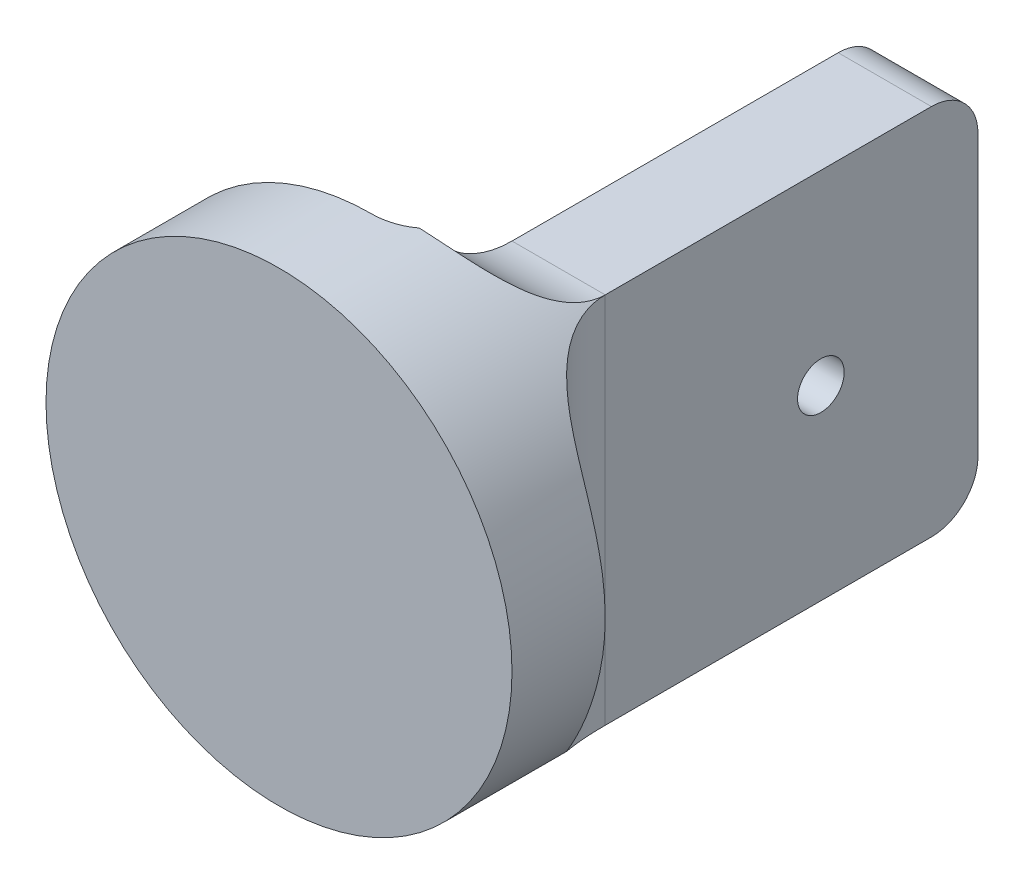
ISO-10303-21;
HEADER;
FILE_DESCRIPTION(('STEP AP214'),'2;1');
FILE_NAME('part.step','',(''),(''),'','','');
FILE_SCHEMA(('AUTOMOTIVE_DESIGN { 1 0 10303 214 1 1 1 1 }'));
ENDSEC;
DATA;
#1=APPLICATION_CONTEXT('core data for automotive mechanical design processes');
#2=APPLICATION_PROTOCOL_DEFINITION('international standard','automotive_design',2000,#1);
#3=PRODUCT_CONTEXT('',#1,'mechanical');
#4=PRODUCT('Part','Part','',(#3));
#5=PRODUCT_RELATED_PRODUCT_CATEGORY('part','',(#4));
#6=PRODUCT_DEFINITION_FORMATION('','',#4);
#7=PRODUCT_DEFINITION_CONTEXT('part definition',#1,'design');
#8=PRODUCT_DEFINITION('design','',#6,#7);
#9=PRODUCT_DEFINITION_SHAPE('','',#8);
#10=(LENGTH_UNIT() NAMED_UNIT(*) SI_UNIT(.MILLI.,.METRE.));
#11=(NAMED_UNIT(*) PLANE_ANGLE_UNIT() SI_UNIT($,.RADIAN.));
#12=(NAMED_UNIT(*) SI_UNIT($,.STERADIAN.) SOLID_ANGLE_UNIT());
#13=UNCERTAINTY_MEASURE_WITH_UNIT(LENGTH_MEASURE(1.E-05),#10,'distance_accuracy_value','');
#14=(GEOMETRIC_REPRESENTATION_CONTEXT(3) GLOBAL_UNCERTAINTY_ASSIGNED_CONTEXT((#13)) GLOBAL_UNIT_ASSIGNED_CONTEXT((#10,
#11,#12)) REPRESENTATION_CONTEXT('',''));
#15=CARTESIAN_POINT('',(0.,0.,0.));
#16=DIRECTION('',(0.,0.,1.));
#17=DIRECTION('',(1.,0.,0.));
#18=AXIS2_PLACEMENT_3D('',#15,#16,#17);
#19=CARTESIAN_POINT('',(0.,0.,0.));
#20=DIRECTION('',(0.,0.,1.));
#21=DIRECTION('',(1.,0.,0.));
#22=AXIS2_PLACEMENT_3D('',#19,#20,#21);
#23=PLANE('',#22);
#24=CARTESIAN_POINT('',(0.,0.,0.));
#25=DIRECTION('',(0.,0.,1.));
#26=DIRECTION('',(1.,0.,0.));
#27=AXIS2_PLACEMENT_3D('',#24,#25,#26);
#28=CIRCLE('',#27,25.);
#29=CARTESIAN_POINT('',(0.,25.,0.));
#30=VERTEX_POINT('',#29);
#31=CARTESIAN_POINT('',(0.,-25.,0.));
#32=VERTEX_POINT('',#31);
#33=EDGE_CURVE('E192',#30,#32,#28,.T.);
#34=ORIENTED_EDGE('',*,*,#33,.F.);
#35=DIRECTION('',(0.,1.,0.));
#36=VECTOR('',#35,1.);
#37=CARTESIAN_POINT('',(0.,-24.4948974278318,0.));
#38=LINE('',#37,#36);
#39=EDGE_CURVE('E173',#30,#32,#38,.F.);
#40=ORIENTED_EDGE('',*,*,#39,.T.);
#41=EDGE_LOOP('',(#34,#40));
#42=FACE_BOUND('',#41,.T.);
#43=ADVANCED_FACE('F40',(#42),#23,.F.);
#44=CARTESIAN_POINT('',(0.,0.,10.));
#45=DIRECTION('',(0.,0.,-1.));
#46=DIRECTION('',(-1.,0.,0.));
#47=AXIS2_PLACEMENT_3D('',#44,#45,#46);
#48=CYLINDRICAL_SURFACE('',#47,25.);
#49=CARTESIAN_POINT('',(0.,0.,10.));
#50=DIRECTION('',(0.,0.,1.));
#51=DIRECTION('',(1.,0.,0.));
#52=AXIS2_PLACEMENT_3D('',#49,#50,#51);
#53=CIRCLE('',#52,25.);
#54=CARTESIAN_POINT('',(25.,0.,10.));
#55=VERTEX_POINT('',#54);
#56=EDGE_CURVE('E267',#55,#55,#53,.T.);
#57=ORIENTED_EDGE('',*,*,#56,.F.);
#58=EDGE_LOOP('',(#57));
#59=FACE_BOUND('',#58,.T.);
#60=CARTESIAN_POINT('',(25.,0.,0.));
#61=CARTESIAN_POINT('',(25.0000046159509,0.349432953702817,-3.45399671139709E-05));
#62=CARTESIAN_POINT('',(24.9926739664145,0.698865563009704,-1.20042422913209E-06));
#63=CARTESIAN_POINT('',(24.9633752354935,1.39711824798957,-4.70913011507256E-05));
#64=CARTESIAN_POINT('',(24.9414070861986,1.74593832081317,-0.000126322243227558));
#65=CARTESIAN_POINT('',(24.8828492284115,2.44255577104218,-0.000645840196986684));
#66=CARTESIAN_POINT('',(24.8462509220083,2.79035242571184,-0.00108633968082242));
#67=CARTESIAN_POINT('',(24.7584991770932,3.48410114457858,-0.0028196038225481));
#68=CARTESIAN_POINT('',(24.7073458028763,3.83005321691695,-0.00411236471572473));
#69=CARTESIAN_POINT('',(24.5901175388926,4.52219890700806,-0.00823038372369184));
#70=CARTESIAN_POINT('',(24.5239289856145,4.86837321924046,-0.0110675582001229));
#71=CARTESIAN_POINT('',(24.3769846292835,5.55758705443547,-0.019155048986845));
#72=CARTESIAN_POINT('',(24.2962288920155,5.90062659154725,-0.0244053543996924));
#73=CARTESIAN_POINT('',(24.1203399015249,6.58279706894839,-0.0383745381544412));
#74=CARTESIAN_POINT('',(24.0252121235208,6.92192944499528,-0.0470920976560804));
#75=CARTESIAN_POINT('',(23.8207737659331,7.59570239575116,-0.0692406547315912));
#76=CARTESIAN_POINT('',(23.7114641281758,7.93034326711689,-0.0826713394046322));
#77=CARTESIAN_POINT('',(23.425920817176,8.74576410815089,-0.123179169715731));
#78=CARTESIAN_POINT('',(23.241883080716,9.22367787968666,-0.153685687050924));
#79=CARTESIAN_POINT('',(22.8453932256898,10.1660864988862,-0.232783440025726));
#80=CARTESIAN_POINT('',(22.6329407350234,10.6305811707257,-0.281374912508408));
#81=CARTESIAN_POINT('',(22.1821669403672,11.541611496397,-0.402391184638451));
#82=CARTESIAN_POINT('',(21.9439420813763,11.9882060833815,-0.474729056908303));
#83=CARTESIAN_POINT('',(21.4436869797028,12.8616157421083,-0.649981524172594));
#84=CARTESIAN_POINT('',(21.1816668516267,13.2884391025386,-0.752883169329952));
#85=CARTESIAN_POINT('',(20.725323208428,13.9847959905312,-0.957436402753174));
#86=CARTESIAN_POINT('',(20.5362865413855,14.2608175927629,-1.04887415145191));
#87=CARTESIAN_POINT('',(20.1510049070291,14.8002270315322,-1.25159310198008));
#88=CARTESIAN_POINT('',(19.9547619039733,15.0636182662994,-1.36286892788349));
#89=CARTESIAN_POINT('',(19.557524485144,15.5758860433591,-1.60751383455325));
#90=CARTESIAN_POINT('',(19.3565336742949,15.8247731302174,-1.74086658742647));
#91=CARTESIAN_POINT('',(18.9526464275802,16.306313374233,-2.03184990158062));
#92=CARTESIAN_POINT('',(18.7497504051798,16.5389699653567,-2.18947530460245));
#93=CARTESIAN_POINT('',(18.3863208897786,16.9411111499699,-2.49640828143243));
#94=CARTESIAN_POINT('',(18.2254680022492,17.1138950942298,-2.64102194218626));
#95=CARTESIAN_POINT('',(17.907058138408,17.4467842207978,-2.94741434049054));
#96=CARTESIAN_POINT('',(17.749500398098,17.6068923665878,-3.10918904513304));
#97=CARTESIAN_POINT('',(17.4400724815678,17.9134392836471,-3.45015440398656));
#98=CARTESIAN_POINT('',(17.2882012239211,18.0598806619805,-3.62934172321097));
#99=CARTESIAN_POINT('',(16.9926763495596,18.3382158926056,-4.00501271570519));
#100=CARTESIAN_POINT('',(16.8490228191754,18.4701095920814,-4.20149657062739));
#101=CARTESIAN_POINT('',(16.5714798633125,18.7195395447261,-4.61278609001379));
#102=CARTESIAN_POINT('',(16.4376775180196,18.8369528063389,-4.82772546888049));
#103=CARTESIAN_POINT('',(16.183796365624,19.0555192912901,-5.27344480114787));
#104=CARTESIAN_POINT('',(16.0637180949536,19.1566718791109,-5.50422537316886));
#105=CARTESIAN_POINT('',(15.8398893839157,19.3421570617477,-5.97987316292921));
#106=CARTESIAN_POINT('',(15.7361300357316,19.4264988396494,-6.2247325952241));
#107=CARTESIAN_POINT('',(15.5471388594581,19.5780789331575,-6.72658123203546));
#108=CARTESIAN_POINT('',(15.461903791247,19.6453202401947,-6.98356830569345));
#109=CARTESIAN_POINT('',(15.3238714828583,19.7531096533278,-7.46526430288376));
#110=CARTESIAN_POINT('',(15.2680651158112,19.7962083898952,-7.68854824422633));
#111=CARTESIAN_POINT('',(15.1717233436877,19.8701410585593,-8.14034584792389));
#112=CARTESIAN_POINT('',(15.1311852716773,19.9009771326447,-8.36885858955348));
#113=CARTESIAN_POINT('',(15.0659167091916,19.9504347877997,-8.83020755769252));
#114=CARTESIAN_POINT('',(15.0412360636203,19.969017858563,-9.06305507259347));
#115=CARTESIAN_POINT('',(15.0165153332662,19.987605104781,-9.41366343478824));
#116=CARTESIAN_POINT('',(15.0103251198146,19.9922529598163,-9.53079041086811));
#117=CARTESIAN_POINT('',(15.0020668833307,19.9984500378845,-9.76527311182051));
#118=CARTESIAN_POINT('',(14.999998919837,19.9999992161624,-9.88262883997245));
#119=CARTESIAN_POINT('',(15.,20.,-10.));
#120=B_SPLINE_CURVE_WITH_KNOTS('',3,(#60,#61,#62,#63,#64,#65,#66,#67,#68,#69,#70,#71,#72,#73,
#74,#75,#76,#77,#78,#79,#80,#81,#82,#83,#84,#85,#86,#87,#88,#89,#90,#91,#92,#93,#94,#95,#96,#97,
#98,#99,#100,#101,#102,#103,#104,#105,#106,#107,#108,#109,#110,#111,#112,#113,#114,#115,#116,
#117,#118,#119),.UNSPECIFIED.,.F.,.F.,(4,2,2,2,2,2,2,2,2,2,2,2,2,2,2,2,2,2,2,2,2,2,2,2,2,2,2,2,
2,4),(0.,1.04822147170246,2.09644780664092,3.14529107532984,4.19412971097106,5.25117809412387,
6.30822170380515,7.36486362948594,8.42143541877221,9.95928355140511,11.4971518246185,
13.0294521262998,14.5611041179134,15.6008118618453,16.6402382821788,17.6788993586998,
18.7173400098519,19.5470998832674,20.3766651902655,21.2060719250535,22.0354873715095,
22.8715225654577,23.7075904263201,24.5432003168327,25.3786639311844,26.0802760063424,
26.7817654730572,27.4854492926859,27.8374985171506,28.1895528263039),.UNSPECIFIED.);
#121=CARTESIAN_POINT('',(25.,0.,0.));
#122=VERTEX_POINT('',#121);
#123=CARTESIAN_POINT('',(15.,20.,-10.));
#124=VERTEX_POINT('',#123);
#125=EDGE_CURVE('E118',#122,#124,#120,.T.);
#126=ORIENTED_EDGE('',*,*,#125,.T.);
#127=CARTESIAN_POINT('',(15.,20.,-10.));
#128=CARTESIAN_POINT('',(15.000000368758,19.999998483752,-9.90460371137096));
#129=CARTESIAN_POINT('',(14.9981794926783,20.0013655327324,-9.80922230876917));
#130=CARTESIAN_POINT('',(14.9909053300932,20.0068185237063,-9.61868042758798));
#131=CARTESIAN_POINT('',(14.985452215542,20.0109043369903,-9.52351993876427));
#132=CARTESIAN_POINT('',(14.96367127868,20.0272038551653,-9.2387986257714));
#133=CARTESIAN_POINT('',(14.9419218261458,20.0434596990857,-9.0498409944975));
#134=CARTESIAN_POINT('',(14.8844397750932,20.0861821368348,-8.67664458894177));
#135=CARTESIAN_POINT('',(14.8488056429991,20.1125768105229,-8.49238211165316));
#136=CARTESIAN_POINT('',(14.7639811423131,20.1749257043843,-8.12864720166906));
#137=CARTESIAN_POINT('',(14.7147897593399,20.2108806398688,-7.94917512850399));
#138=CARTESIAN_POINT('',(14.6035428527405,20.2914078498538,-7.59669802467493));
#139=CARTESIAN_POINT('',(14.541514019282,20.3359622326089,-7.42368044171297));
#140=CARTESIAN_POINT('',(14.4051870119877,20.4327573868988,-7.0847027708863));
#141=CARTESIAN_POINT('',(14.3308834262005,20.4850015477524,-6.91874583683865));
#142=CARTESIAN_POINT('',(14.1707318232288,20.5961124604615,-6.59467163898267));
#143=CARTESIAN_POINT('',(14.0848759475672,20.6549837159228,-6.43655981293168));
#144=CARTESIAN_POINT('',(13.9024677894584,20.7781985245378,-6.12884011003592));
#145=CARTESIAN_POINT('',(13.8059116727839,20.8425440373563,-5.97923531076709));
#146=CARTESIAN_POINT('',(13.5147653622096,21.0333621637981,-5.56284739075482));
#147=CARTESIAN_POINT('',(13.3078277852501,21.165282715701,-5.307066261446));
#148=CARTESIAN_POINT('',(12.8650672516241,21.4372942648249,-4.82735356059047));
#149=CARTESIAN_POINT('',(12.6292470624655,21.5773844785629,-4.60341894197461));
#150=CARTESIAN_POINT('',(12.1321400084591,21.8607751607148,-4.18473705622961));
#151=CARTESIAN_POINT('',(11.8707142828961,22.0040894721007,-3.99016533312621));
#152=CARTESIAN_POINT('',(11.3276979347034,22.2885021289161,-3.62931280696413));
#153=CARTESIAN_POINT('',(11.0460903802653,22.4295984896585,-3.46305616350226));
#154=CARTESIAN_POINT('',(10.4655691637553,22.706290834931,-3.15568028151899));
#155=CARTESIAN_POINT('',(10.1665994984812,22.8418663115536,-3.01464914566645));
#156=CARTESIAN_POINT('',(9.55535772013658,23.1042369341131,-2.75552351783486));
#157=CARTESIAN_POINT('',(9.24308882088028,23.2310341821169,-2.63742352237094));
#158=CARTESIAN_POINT('',(8.61415076106215,23.4714180108463,-2.42352584740173));
#159=CARTESIAN_POINT('',(8.29770083186422,23.5852210922946,-2.32732284705193));
#160=CARTESIAN_POINT('',(7.65626543304726,23.8011794929119,-2.15181668058429));
#161=CARTESIAN_POINT('',(7.33127933405196,23.9033339502391,-2.07251476454318));
#162=CARTESIAN_POINT('',(6.67499402964776,24.0948358768326,-1.92885802663078));
#163=CARTESIAN_POINT('',(6.34370710874135,24.1842058479972,-1.86447681586633));
#164=CARTESIAN_POINT('',(5.67566460067085,24.3496452635155,-1.74871661087124));
#165=CARTESIAN_POINT('',(5.33891006278793,24.4257172276527,-1.69733515254492));
#166=CARTESIAN_POINT('',(4.76229669147013,24.5434187444668,-1.61971983906676));
#167=CARTESIAN_POINT('',(4.52353301992748,24.588549809578,-1.59055831530323));
#168=CARTESIAN_POINT('',(4.04443407026775,24.6718799481672,-1.53752326615536));
#169=CARTESIAN_POINT('',(3.8041003673843,24.7100851120243,-1.51364509067584));
#170=CARTESIAN_POINT('',(3.56304477219613,24.7447916126066,-1.49219271462558));
#171=B_SPLINE_CURVE_WITH_KNOTS('',3,(#127,#128,#129,#130,#131,#132,#133,#134,#135,#136,#137,
#138,#139,#140,#141,#142,#143,#144,#145,#146,#147,#148,#149,#150,#151,#152,#153,#154,#155,#156,
#157,#158,#159,#160,#161,#162,#163,#164,#165,#166,#167,#168,#169,#170),.UNSPECIFIED.,.F.,.F.,(4,
2,2,2,2,2,2,2,2,2,2,2,2,2,2,2,2,2,2,2,2,4),(0.,0.28613220946486,0.572250874071506,
1.14401924796472,1.71180450590527,2.27963225824217,2.84629109849558,3.41320044933045,
3.98049741006994,4.54799831220931,5.60807776681834,6.66805572485268,7.73413899803005,
8.80112738924817,9.87177252060851,10.9421603781419,11.9907428001641,13.0394027529476,
14.086193636394,15.1327859523178,15.8668404508198,16.6002462844248),.UNSPECIFIED.);
#172=CARTESIAN_POINT('',(3.56304477219613,24.7447916126066,-1.49219271462558));
#173=VERTEX_POINT('',#172);
#174=EDGE_CURVE('E64',#124,#173,#171,.T.);
#175=ORIENTED_EDGE('',*,*,#174,.T.);
#176=CARTESIAN_POINT('',(3.56304477219613,24.7447916126066,-1.49219271462558));
#177=CARTESIAN_POINT('',(3.46479568104161,24.7589419425906,-1.3923784238763));
#178=CARTESIAN_POINT('',(3.36233587103662,24.7730950559716,-1.29671058569221));
#179=CARTESIAN_POINT('',(3.14971931088456,24.8010225591477,-1.11427516317151));
#180=CARTESIAN_POINT('',(3.03956213547426,24.8147969279591,-1.02750807123702));
#181=CARTESIAN_POINT('',(2.8121323177158,24.841599156264,-0.8633814913431));
#182=CARTESIAN_POINT('',(2.6948502318873,24.8546259784559,-0.786034916039318));
#183=CARTESIAN_POINT('',(2.45411280229474,24.8795491898831,-0.641440387404467));
#184=CARTESIAN_POINT('',(2.33065786029156,24.8914456525421,-0.574191777983868));
#185=CARTESIAN_POINT('',(2.07826991017084,24.9137885697029,-0.450210417843046));
#186=CARTESIAN_POINT('',(1.94933073567569,24.9242333324644,-0.39348991067214));
#187=CARTESIAN_POINT('',(1.68701331129949,24.9433613756515,-0.291092655198119));
#188=CARTESIAN_POINT('',(1.55363515079903,24.9520446915194,-0.245415684682275));
#189=CARTESIAN_POINT('',(1.28366917217953,24.9673874392098,-0.165543474078923));
#190=CARTESIAN_POINT('',(1.14708845545735,24.9740509628928,-0.131325005476799));
#191=CARTESIAN_POINT('',(0.871496973491643,24.9851855492483,-0.0745281263692388));
#192=CARTESIAN_POINT('',(0.732487425265588,24.9896576790846,-0.0519440498773154));
#193=CARTESIAN_POINT('',(0.4943934545442,24.9953047740965,-0.0235159341925867));
#194=CARTESIAN_POINT('',(0.39566776846988,24.9970638255859,-0.0146958002071293));
#195=CARTESIAN_POINT('',(0.197964712283686,24.9994120544301,-0.00293972657877377));
#196=CARTESIAN_POINT('',(0.0989877517209831,25.0000025492448,2.83961561373932E-06));
#197=CARTESIAN_POINT('',(0.,25.,0.));
#198=B_SPLINE_CURVE_WITH_KNOTS('',3,(#176,#177,#178,#179,#180,#181,#182,#183,#184,#185,#186,
#187,#188,#189,#190,#191,#192,#193,#194,#195,#196,#197),.UNSPECIFIED.,.F.,.F.,(4,2,2,2,2,2,2,2,
2,2,4),(0.,0.4221842969074,0.844391937077718,1.26717193331088,1.68992444859738,2.1131655608067,
2.53639815605318,2.95876751141122,3.38093097661401,3.67816282825741,3.97505938195277),.UNSPECIFIED.);
#199=EDGE_CURVE('E172',#173,#30,#198,.T.);
#200=ORIENTED_EDGE('',*,*,#199,.T.);
#201=ORIENTED_EDGE('',*,*,#33,.T.);
#202=CARTESIAN_POINT('',(0.,-25.,0.));
#203=CARTESIAN_POINT('',(0.139067941625275,-25.000011515138,1.65544081296386E-05));
#204=CARTESIAN_POINT('',(0.278131674336748,-24.9988400077698,-0.00580124617566364));
#205=CARTESIAN_POINT('',(0.555243656303546,-24.9942143656643,-0.0289849795968277));
#206=CARTESIAN_POINT('',(0.693291991291745,-24.9907604259289,-0.0463499258924752));
#207=CARTESIAN_POINT('',(0.967350216120895,-24.9816546391409,-0.0925006759157653));
#208=CARTESIAN_POINT('',(1.10336068909617,-24.9760034338107,-0.121283145147235));
#209=CARTESIAN_POINT('',(1.37241572744407,-24.9626642610375,-0.1900362875354));
#210=CARTESIAN_POINT('',(1.50546038439968,-24.9549763565814,-0.230006614698269));
#211=CARTESIAN_POINT('',(1.76770159405711,-24.9377727224976,-0.320844711176445));
#212=CARTESIAN_POINT('',(1.89689687127807,-24.9282563946385,-0.371716047760295));
#213=CARTESIAN_POINT('',(2.15050908037118,-24.9076594197956,-0.483968501504646));
#214=CARTESIAN_POINT('',(2.27492596112185,-24.8965787560816,-0.545349731066501));
#215=CARTESIAN_POINT('',(2.51797850060264,-24.8731717640665,-0.678086770045653));
#216=CARTESIAN_POINT('',(2.63662156512102,-24.8608470973294,-0.749429322129395));
#217=CARTESIAN_POINT('',(2.86747460222681,-24.8352787615647,-0.901623116296223));
#218=CARTESIAN_POINT('',(2.9796872727714,-24.8220354831851,-0.982470326478427));
#219=CARTESIAN_POINT('',(3.17193323062921,-24.7981035719909,-1.13345854812025));
#220=CARTESIAN_POINT('',(3.2534230037314,-24.7875295258644,-1.20177329907035));
#221=CARTESIAN_POINT('',(3.41175393127952,-24.7662333641178,-1.34333458699481));
#222=CARTESIAN_POINT('',(3.4886019746197,-24.7555114984552,-1.41657345666005));
#223=CARTESIAN_POINT('',(3.56304477219613,-24.7447916126066,-1.49219271462558));
#224=B_SPLINE_CURVE_WITH_KNOTS('',3,(#202,#203,#204,#205,#206,#207,#208,#209,#210,#211,#212,
#213,#214,#215,#216,#217,#218,#219,#220,#221,#222,#223),.UNSPECIFIED.,.F.,.F.,(4,2,2,2,2,2,2,2,
2,2,4),(0.,0.417070906885443,0.834106185486118,1.25101975818357,1.66792043890582,
2.08495775596897,2.50199953344741,2.91849147663077,3.33480737604872,3.65518429791174,
3.9750734265343),.UNSPECIFIED.);
#225=CARTESIAN_POINT('',(3.56304477219613,-24.7447916126066,-1.49219271462558));
#226=VERTEX_POINT('',#225);
#227=EDGE_CURVE('E50',#32,#226,#224,.T.);
#228=ORIENTED_EDGE('',*,*,#227,.T.);
#229=CARTESIAN_POINT('',(3.56304477219613,-24.7447916126066,-1.49219271462558));
#230=CARTESIAN_POINT('',(3.80386380981412,-24.7101182354389,-1.51362313294646));
#231=CARTESIAN_POINT('',(4.04395490999744,-24.6719556833986,-1.53747517553623));
#232=CARTESIAN_POINT('',(4.52305239828068,-24.5886410058038,-1.59050014253432));
#233=CARTESIAN_POINT('',(4.76205364339555,-24.5434689911747,-1.61968825115972));
#234=CARTESIAN_POINT('',(5.41033267168758,-24.4111369549297,-1.70694708165892));
#235=CARTESIAN_POINT('',(5.81752829916441,-24.3172668500559,-1.77062273933733));
#236=CARTESIAN_POINT('',(6.62359540649537,-24.1101885957646,-1.91753455196024));
#237=CARTESIAN_POINT('',(7.02246335803931,-23.9969724290884,-2.00077882178621));
#238=CARTESIAN_POINT('',(7.80880847730482,-23.7527226058729,-2.19004573292436));
#239=CARTESIAN_POINT('',(8.19629614073143,-23.6217060365401,-2.29604658535724));
#240=CARTESIAN_POINT('',(8.95701494090954,-23.3438549546819,-2.53479392248256));
#241=CARTESIAN_POINT('',(9.33025402482736,-23.197029439518,-2.66752523109405));
#242=CARTESIAN_POINT('',(9.90433013115736,-22.9555278953163,-2.90137667329253));
#243=CARTESIAN_POINT('',(10.1112393584226,-22.8650994418645,-2.99207915608406));
#244=CARTESIAN_POINT('',(10.5181281055857,-22.6808026575916,-3.18478610986706));
#245=CARTESIAN_POINT('',(10.7181089315336,-22.586934982027,-3.28678843537733));
#246=CARTESIAN_POINT('',(11.1100364482988,-22.3967517200867,-3.50297557313264));
#247=CARTESIAN_POINT('',(11.3019874894388,-22.300437505859,-3.61715366667412));
#248=CARTESIAN_POINT('',(11.6767543911186,-22.1065148955201,-3.85859519446928));
#249=CARTESIAN_POINT('',(11.8595707258747,-22.0089065669246,-3.98585794839921));
#250=CARTESIAN_POINT('',(12.354679098166,-21.7368941304088,-4.3600362022938));
#251=CARTESIAN_POINT('',(12.6556657877791,-21.5624937024233,-4.62231009925595));
#252=CARTESIAN_POINT('',(13.2157314112813,-21.2238453204421,-5.19486732063013));
#253=CARTESIAN_POINT('',(13.474807185525,-21.059598132471,-5.50515426127725));
#254=CARTESIAN_POINT('',(13.8254550531312,-20.8297106664569,-6.00746844488061));
#255=CARTESIAN_POINT('',(13.9365331006092,-20.7554530711782,-6.1821585137484));
#256=CARTESIAN_POINT('',(14.1440529156528,-20.6145927236057,-6.54289774917025));
#257=CARTESIAN_POINT('',(14.2405025205045,-20.5479858770469,-6.72894075784979));
#258=CARTESIAN_POINT('',(14.4173841958279,-20.4242672814121,-7.11112010162743));
#259=CARTESIAN_POINT('',(14.4978422610309,-20.3671401481565,-7.30723939325137));
#260=CARTESIAN_POINT('',(14.6417783252794,-20.2639133958091,-7.70839372462543));
#261=CARTESIAN_POINT('',(14.705262023413,-20.2178100760591,-7.91342574500936));
#262=CARTESIAN_POINT('',(14.7992692452483,-20.149044996298,-8.27304349322701));
#263=CARTESIAN_POINT('',(14.8340549552554,-20.1234242557284,-8.4259678842339));
#264=CARTESIAN_POINT('',(14.8939276322245,-20.0791509265913,-8.73467116784114));
#265=CARTESIAN_POINT('',(14.9190172149452,-20.0604964587535,-8.89044927868891));
#266=CARTESIAN_POINT('',(14.95936653521,-20.0304275117068,-9.20463817474296));
#267=CARTESIAN_POINT('',(14.9745845379076,-20.0190437746101,-9.36305727016772));
#268=CARTESIAN_POINT('',(14.994911691989,-20.0038158893651,-9.68098031925999));
#269=CARTESIAN_POINT('',(15.000015848924,-19.9999754662863,-9.84048476990897));
#270=CARTESIAN_POINT('',(15.,-20.,-10.));
#271=B_SPLINE_CURVE_WITH_KNOTS('',3,(#229,#230,#231,#232,#233,#234,#235,#236,#237,#238,#239,
#240,#241,#242,#243,#244,#245,#246,#247,#248,#249,#250,#251,#252,#253,#254,#255,#256,#257,#258,
#259,#260,#261,#262,#263,#264,#265,#266,#267,#268,#269,#270),.UNSPECIFIED.,.F.,.F.,(4,2,2,2,2,2,
2,2,2,2,2,2,2,2,2,2,2,2,2,2,4),(0.,0.732671024319646,1.4674603278368,2.73458650846945,
4.00223908180755,5.26868327893591,6.53441047560694,7.26411278354724,7.99367678089096,
8.72284026096678,9.45196584807444,10.7547840552762,12.0577004356366,12.7167251680341,
13.375395566743,14.0329863590726,14.6903560894216,15.166648756737,15.6428128430411,
16.1209771465103,16.5993775196822),.UNSPECIFIED.);
#272=CARTESIAN_POINT('',(15.,-20.,-10.));
#273=VERTEX_POINT('',#272);
#274=EDGE_CURVE('E56',#226,#273,#271,.T.);
#275=ORIENTED_EDGE('',*,*,#274,.T.);
#276=CARTESIAN_POINT('',(15.,-20.,-10.));
#277=CARTESIAN_POINT('',(14.9999544474207,-20.0000019256207,-9.76769462868317));
#278=CARTESIAN_POINT('',(15.0080929267355,-19.9939293575422,-9.53539914160228));
#279=CARTESIAN_POINT('',(15.0404069350246,-19.9696497604848,-9.07260864137797));
#280=CARTESIAN_POINT('',(15.0645793169829,-19.9514451126975,-8.84211328389877));
#281=CARTESIAN_POINT('',(15.1285279258781,-19.9029934815473,-8.38534286158488));
#282=CARTESIAN_POINT('',(15.1682539981283,-19.8727852006747,-8.15905665646658));
#283=CARTESIAN_POINT('',(15.2626775569431,-19.8003594280702,-7.71158985934686));
#284=CARTESIAN_POINT('',(15.3173752016383,-19.7581418094949,-7.49040932129854));
#285=CARTESIAN_POINT('',(15.4408831561763,-19.6617712142473,-7.05474159051967));
#286=CARTESIAN_POINT('',(15.5096908702974,-19.6076204326913,-6.84025317504017));
#287=CARTESIAN_POINT('',(15.6603669797968,-19.4874878756637,-6.41932557463815));
#288=CARTESIAN_POINT('',(15.7422360036319,-19.4215055308868,-6.21288677762538));
#289=CARTESIAN_POINT('',(15.9178019462584,-19.2778742704624,-5.80928193798633));
#290=CARTESIAN_POINT('',(16.0115004610714,-19.2002237802924,-5.61211715153519));
#291=CARTESIAN_POINT('',(16.2093285924134,-19.0335070749173,-5.22812955184818));
#292=CARTESIAN_POINT('',(16.3134584022088,-18.9444406481941,-5.04130693032709));
#293=CARTESIAN_POINT('',(16.5334979194005,-18.752740599462,-4.67408694702865));
#294=CARTESIAN_POINT('',(16.6496443462394,-18.6498132676828,-4.49398505626831));
#295=CARTESIAN_POINT('',(16.8896773468836,-18.432714968241,-4.14617032867569));
#296=CARTESIAN_POINT('',(17.0135638613238,-18.3185440868107,-3.97845739684369));
#297=CARTESIAN_POINT('',(17.2674446813404,-18.0794291163717,-3.6557305556387));
#298=CARTESIAN_POINT('',(17.3974408693146,-17.9544816970647,-3.50072060096508));
#299=CARTESIAN_POINT('',(17.6618901658091,-17.6944075897653,-3.20355035200659));
#300=CARTESIAN_POINT('',(17.7963441775275,-17.5592788317904,-3.0613926837333));
#301=CARTESIAN_POINT('',(18.1222447821601,-17.2237762172362,-2.73580158968605));
#302=CARTESIAN_POINT('',(18.3150859826731,-17.018831616906,-2.5584449421077));
#303=CARTESIAN_POINT('',(18.7026215812628,-16.5920197076693,-2.22774280832841));
#304=CARTESIAN_POINT('',(18.897316548963,-16.3701470399338,-2.07440497292895));
#305=CARTESIAN_POINT('',(19.2854937280005,-15.9110084447857,-1.79010534913545));
#306=CARTESIAN_POINT('',(19.4789741996376,-15.6737243293046,-1.6591706873741));
#307=CARTESIAN_POINT('',(19.861823086655,-15.1856610978914,-1.41802228976428));
#308=CARTESIAN_POINT('',(20.0511902745907,-14.9348780293255,-1.30781466592753));
#309=CARTESIAN_POINT('',(20.503756244849,-14.3108867326178,-1.06268421019479));
#310=CARTESIAN_POINT('',(20.7636624469471,-13.9314328943902,-0.937531823478148));
#311=CARTESIAN_POINT('',(21.2658350427095,-13.1521662209654,-0.719319868492703));
#312=CARTESIAN_POINT('',(21.5080936138608,-12.7523444893035,-0.626274464540282));
#313=CARTESIAN_POINT('',(21.9722508715262,-11.9348919848639,-0.466211361781585));
#314=CARTESIAN_POINT('',(22.1941022210551,-11.5172229414369,-0.399253067192524));
#315=CARTESIAN_POINT('',(22.6146861161517,-10.6677379048163,-0.286210400068965));
#316=CARTESIAN_POINT('',(22.8134192897809,-10.2359222963574,-0.240125460360479));
#317=CARTESIAN_POINT('',(23.1308755550073,-9.49075309596489,-0.175327010071725));
#318=CARTESIAN_POINT('',(23.2558151545867,-9.18036588503581,-0.152549301352628));
#319=CARTESIAN_POINT('',(23.4932663712132,-8.55444103500423,-0.113431111241263));
#320=CARTESIAN_POINT('',(23.60577701841,-8.23890299617659,-0.0970911319400031));
#321=CARTESIAN_POINT('',(23.8181200028185,-7.60325567441595,-0.0695104333791623));
#322=CARTESIAN_POINT('',(23.91794784397,-7.28314481490416,-0.0582715188372613));
#323=CARTESIAN_POINT('',(24.1046841785804,-6.63902504572305,-0.0397181334085059));
#324=CARTESIAN_POINT('',(24.1915910864042,-6.31501566289861,-0.0324041438949023));
#325=CARTESIAN_POINT('',(24.3521985479187,-5.6641532620826,-0.020680019726942));
#326=CARTESIAN_POINT('',(24.4259166818367,-5.33730464773368,-0.0162659981998946));
#327=CARTESIAN_POINT('',(24.5601532217831,-4.68092650348939,-0.00945189305866386));
#328=CARTESIAN_POINT('',(24.6206731211415,-4.35139728127563,-0.00705158151328772));
#329=CARTESIAN_POINT('',(24.7283960315422,-3.69032975869593,-0.00354399907821539));
#330=CARTESIAN_POINT('',(24.7756054710901,-3.35879250744546,-0.00243610318112393));
#331=CARTESIAN_POINT('',(24.8566647160628,-2.69412051635443,-0.000944813003380129));
#332=CARTESIAN_POINT('',(24.8905162309109,-2.36098598644495,-0.000561325995787661));
#333=CARTESIAN_POINT('',(24.9313918147699,-1.85859301228581,-0.000226526121881477));
#334=CARTESIAN_POINT('',(24.9434056508824,-1.68972656857743,-0.000155287797385632));
#335=CARTESIAN_POINT('',(24.963999191122,-1.35180954631155,-5.9059999097377E-05));
#336=CARTESIAN_POINT('',(24.9725794294714,-1.18275900050511,-3.40633285210083E-05));
#337=CARTESIAN_POINT('',(24.9931453095933,-0.675956738440726,4.69093719138867E-06));
#338=CARTESIAN_POINT('',(25.0000020082629,-0.3379899275337,-1.75827729999736E-05));
#339=CARTESIAN_POINT('',(25.,0.,0.));
#340=B_SPLINE_CURVE_WITH_KNOTS('',3,(#276,#277,#278,#279,#280,#281,#282,#283,#284,#285,#286,
#287,#288,#289,#290,#291,#292,#293,#294,#295,#296,#297,#298,#299,#300,#301,#302,#303,#304,#305,
#306,#307,#308,#309,#310,#311,#312,#313,#314,#315,#316,#317,#318,#319,#320,#321,#322,#323,#324,
#325,#326,#327,#328,#329,#330,#331,#332,#333,#334,#335,#336,#337,#338,#339),.UNSPECIFIED.,.F.,
.F.,(4,2,2,2,2,2,2,2,2,2,2,2,2,2,2,2,2,2,2,2,2,2,2,2,2,2,2,2,2,2,2,4),(0.,0.696679256652002,
1.3932218146918,2.08753654787055,2.78185861472311,3.47605306684763,4.17028093084503,
4.86460255958196,5.55893705479097,6.27141540287411,6.98388828703913,7.6965821427073,
8.40942129022861,9.40583337917937,10.4025622163624,11.4004895195612,12.3987106328461,
13.8264601146285,15.2548386595049,16.6864510842066,18.1180246065827,19.1238037538083,
20.1296613281801,21.1358744904007,22.1422110316572,23.147195997523,24.1520671941064,
25.1564522370031,26.1607087062922,26.6685590148724,27.1763302779119,28.1901751577332),.UNSPECIFIED.);
#341=EDGE_CURVE('E115',#273,#122,#340,.T.);
#342=ORIENTED_EDGE('',*,*,#341,.T.);
#343=EDGE_LOOP('',(#126,#175,#200,#201,#228,#275,#342));
#344=FACE_BOUND('',#343,.T.);
#345=ADVANCED_FACE('F117',(#59,#344),#48,.T.);
#346=CARTESIAN_POINT('',(0.,0.,10.));
#347=DIRECTION('',(0.,0.,1.));
#348=DIRECTION('',(1.,0.,0.));
#349=AXIS2_PLACEMENT_3D('',#346,#347,#348);
#350=PLANE('',#349);
#351=ORIENTED_EDGE('',*,*,#56,.T.);
#352=EDGE_LOOP('',(#351));
#353=FACE_BOUND('',#352,.T.);
#354=ADVANCED_FACE('F284',(#353),#350,.T.);
#355=CARTESIAN_POINT('',(0.,-20.,-50.));
#356=DIRECTION('',(0.,1.,0.));
#357=DIRECTION('',(0.,0.,1.));
#358=AXIS2_PLACEMENT_3D('',#355,#356,#357);
#359=PLANE('',#358);
#360=DIRECTION('',(0.,0.,1.));
#361=VECTOR('',#360,1.);
#362=CARTESIAN_POINT('',(5.,-20.,-50.));
#363=LINE('',#362,#361);
#364=CARTESIAN_POINT('',(5.,-20.,-45.));
#365=VERTEX_POINT('',#364);
#366=CARTESIAN_POINT('',(5.,-20.,-10.));
#367=VERTEX_POINT('',#366);
#368=EDGE_CURVE('E208',#365,#367,#363,.T.);
#369=ORIENTED_EDGE('',*,*,#368,.F.);
#370=DIRECTION('',(-1.,0.,0.));
#371=VECTOR('',#370,1.);
#372=CARTESIAN_POINT('',(15.,-20.,-45.));
#373=LINE('',#372,#371);
#374=CARTESIAN_POINT('',(15.,-20.,-45.));
#375=VERTEX_POINT('',#374);
#376=EDGE_CURVE('E228',#365,#375,#373,.F.);
#377=ORIENTED_EDGE('',*,*,#376,.T.);
#378=DIRECTION('',(0.,0.,1.));
#379=VECTOR('',#378,1.);
#380=CARTESIAN_POINT('',(15.,-20.,-50.));
#381=LINE('',#380,#379);
#382=EDGE_CURVE('E259',#375,#273,#381,.T.);
#383=ORIENTED_EDGE('',*,*,#382,.T.);
#384=DIRECTION('',(-1.,0.,0.));
#385=VECTOR('',#384,1.);
#386=CARTESIAN_POINT('',(5.,-20.,-10.));
#387=LINE('',#386,#385);
#388=EDGE_CURVE('E128',#273,#367,#387,.T.);
#389=ORIENTED_EDGE('',*,*,#388,.T.);
#390=EDGE_LOOP('',(#369,#377,#383,#389));
#391=FACE_BOUND('',#390,.T.);
#392=ADVANCED_FACE('F271',(#391),#359,.F.);
#393=CARTESIAN_POINT('',(5.,0.,-50.));
#394=DIRECTION('',(1.,0.,0.));
#395=DIRECTION('',(0.,0.,-1.));
#396=AXIS2_PLACEMENT_3D('',#393,#394,#395);
#397=PLANE('',#396);
#398=CARTESIAN_POINT('',(5.,0.,-33.1408871272104));
#399=DIRECTION('',(-1.,0.,0.));
#400=DIRECTION('',(0.,0.,1.));
#401=AXIS2_PLACEMENT_3D('',#398,#399,#400);
#402=CIRCLE('',#401,2.5);
#403=CARTESIAN_POINT('',(5.,0.,-30.6408871272104));
#404=VERTEX_POINT('',#403);
#405=EDGE_CURVE('E312',#404,#404,#402,.T.);
#406=ORIENTED_EDGE('',*,*,#405,.F.);
#407=EDGE_LOOP('',(#406));
#408=FACE_BOUND('',#407,.T.);
#409=DIRECTION('',(0.,1.,0.));
#410=VECTOR('',#409,1.);
#411=CARTESIAN_POINT('',(5.,0.,-50.));
#412=LINE('',#411,#410);
#413=CARTESIAN_POINT('',(5.,-15.,-50.));
#414=VERTEX_POINT('',#413);
#415=CARTESIAN_POINT('',(5.,15.,-50.));
#416=VERTEX_POINT('',#415);
#417=EDGE_CURVE('E254',#414,#416,#412,.T.);
#418=ORIENTED_EDGE('',*,*,#417,.F.);
#419=CARTESIAN_POINT('',(5.,-15.,-45.));
#420=DIRECTION('',(1.,0.,0.));
#421=DIRECTION('',(0.,0.,-1.));
#422=AXIS2_PLACEMENT_3D('',#419,#420,#421);
#423=CIRCLE('',#422,5.);
#424=EDGE_CURVE('E226',#414,#365,#423,.F.);
#425=ORIENTED_EDGE('',*,*,#424,.T.);
#426=ORIENTED_EDGE('',*,*,#368,.T.);
#427=CARTESIAN_POINT('',(5.,-30.,-10.));
#428=DIRECTION('',(1.,0.,0.));
#429=DIRECTION('',(0.,0.,-1.));
#430=AXIS2_PLACEMENT_3D('',#427,#428,#429);
#431=CIRCLE('',#430,10.);
#432=CARTESIAN_POINT('',(5.,-21.3397459621556,-5.));
#433=VERTEX_POINT('',#432);
#434=EDGE_CURVE('E200',#367,#433,#431,.T.);
#435=ORIENTED_EDGE('',*,*,#434,.T.);
#436=DIRECTION('',(0.,1.,0.));
#437=VECTOR('',#436,1.);
#438=CARTESIAN_POINT('',(5.,24.4948974278318,-5.));
#439=LINE('',#438,#437);
#440=CARTESIAN_POINT('',(5.,21.3397459621556,-5.));
#441=VERTEX_POINT('',#440);
#442=EDGE_CURVE('E197',#433,#441,#439,.T.);
#443=ORIENTED_EDGE('',*,*,#442,.T.);
#444=CARTESIAN_POINT('',(5.,30.,-10.));
#445=DIRECTION('',(1.,0.,0.));
#446=DIRECTION('',(0.,0.,-1.));
#447=AXIS2_PLACEMENT_3D('',#444,#445,#446);
#448=CIRCLE('',#447,10.);
#449=CARTESIAN_POINT('',(5.,20.,-10.));
#450=VERTEX_POINT('',#449);
#451=EDGE_CURVE('E209',#441,#450,#448,.T.);
#452=ORIENTED_EDGE('',*,*,#451,.T.);
#453=DIRECTION('',(0.,0.,1.));
#454=VECTOR('',#453,1.);
#455=CARTESIAN_POINT('',(5.,20.,-50.));
#456=LINE('',#455,#454);
#457=CARTESIAN_POINT('',(5.,20.,-45.));
#458=VERTEX_POINT('',#457);
#459=EDGE_CURVE('E241',#458,#450,#456,.T.);
#460=ORIENTED_EDGE('',*,*,#459,.F.);
#461=CARTESIAN_POINT('',(5.,15.,-45.));
#462=DIRECTION('',(1.,0.,0.));
#463=DIRECTION('',(0.,0.,-1.));
#464=AXIS2_PLACEMENT_3D('',#461,#462,#463);
#465=CIRCLE('',#464,5.);
#466=EDGE_CURVE('E224',#458,#416,#465,.F.);
#467=ORIENTED_EDGE('',*,*,#466,.T.);
#468=EDGE_LOOP('',(#418,#425,#426,#435,#443,#452,#460,#467));
#469=FACE_BOUND('',#468,.T.);
#470=ADVANCED_FACE('F204',(#408,#469),#397,.F.);
#471=CARTESIAN_POINT('',(0.,20.,-50.));
#472=DIRECTION('',(0.,-1.,0.));
#473=DIRECTION('',(0.,0.,-1.));
#474=AXIS2_PLACEMENT_3D('',#471,#472,#473);
#475=PLANE('',#474);
#476=DIRECTION('',(0.,0.,1.));
#477=VECTOR('',#476,1.);
#478=CARTESIAN_POINT('',(15.,20.,-50.));
#479=LINE('',#478,#477);
#480=CARTESIAN_POINT('',(15.,20.,-45.));
#481=VERTEX_POINT('',#480);
#482=EDGE_CURVE('E244',#481,#124,#479,.T.);
#483=ORIENTED_EDGE('',*,*,#482,.F.);
#484=DIRECTION('',(1.,0.,0.));
#485=VECTOR('',#484,1.);
#486=CARTESIAN_POINT('',(5.,20.,-45.));
#487=LINE('',#486,#485);
#488=EDGE_CURVE('E233',#481,#458,#487,.F.);
#489=ORIENTED_EDGE('',*,*,#488,.T.);
#490=ORIENTED_EDGE('',*,*,#459,.T.);
#491=DIRECTION('',(1.,0.,0.));
#492=VECTOR('',#491,1.);
#493=CARTESIAN_POINT('',(15.,20.,-10.));
#494=LINE('',#493,#492);
#495=EDGE_CURVE('E125',#450,#124,#494,.T.);
#496=ORIENTED_EDGE('',*,*,#495,.T.);
#497=EDGE_LOOP('',(#483,#489,#490,#496));
#498=FACE_BOUND('',#497,.T.);
#499=ADVANCED_FACE('F294',(#498),#475,.F.);
#500=CARTESIAN_POINT('',(15.,0.,-50.));
#501=DIRECTION('',(-1.,0.,0.));
#502=DIRECTION('',(0.,0.,1.));
#503=AXIS2_PLACEMENT_3D('',#500,#501,#502);
#504=PLANE('',#503);
#505=CARTESIAN_POINT('',(15.,0.,-33.1408871272104));
#506=DIRECTION('',(-1.,0.,0.));
#507=DIRECTION('',(0.,0.,1.));
#508=AXIS2_PLACEMENT_3D('',#505,#506,#507);
#509=CIRCLE('',#508,2.5);
#510=CARTESIAN_POINT('',(15.,0.,-30.6408871272104));
#511=VERTEX_POINT('',#510);
#512=EDGE_CURVE('E45',#511,#511,#509,.T.);
#513=ORIENTED_EDGE('',*,*,#512,.T.);
#514=EDGE_LOOP('',(#513));
#515=FACE_BOUND('',#514,.T.);
#516=ORIENTED_EDGE('',*,*,#382,.F.);
#517=CARTESIAN_POINT('',(15.,-15.,-45.));
#518=DIRECTION('',(-1.,0.,0.));
#519=DIRECTION('',(0.,0.,1.));
#520=AXIS2_PLACEMENT_3D('',#517,#518,#519);
#521=CIRCLE('',#520,5.);
#522=CARTESIAN_POINT('',(15.,-15.,-50.));
#523=VERTEX_POINT('',#522);
#524=EDGE_CURVE('E232',#375,#523,#521,.F.);
#525=ORIENTED_EDGE('',*,*,#524,.T.);
#526=DIRECTION('',(0.,-1.,0.));
#527=VECTOR('',#526,1.);
#528=CARTESIAN_POINT('',(15.,0.,-50.));
#529=LINE('',#528,#527);
#530=CARTESIAN_POINT('',(15.,15.,-50.));
#531=VERTEX_POINT('',#530);
#532=EDGE_CURVE('E252',#531,#523,#529,.T.);
#533=ORIENTED_EDGE('',*,*,#532,.F.);
#534=CARTESIAN_POINT('',(15.,15.,-45.));
#535=DIRECTION('',(-1.,0.,0.));
#536=DIRECTION('',(0.,0.,1.));
#537=AXIS2_PLACEMENT_3D('',#534,#535,#536);
#538=CIRCLE('',#537,5.);
#539=EDGE_CURVE('E230',#531,#481,#538,.F.);
#540=ORIENTED_EDGE('',*,*,#539,.T.);
#541=ORIENTED_EDGE('',*,*,#482,.T.);
#542=DIRECTION('',(0.,-1.,0.));
#543=VECTOR('',#542,1.);
#544=CARTESIAN_POINT('',(15.,-20.,-10.));
#545=LINE('',#544,#543);
#546=EDGE_CURVE('E122',#124,#273,#545,.T.);
#547=ORIENTED_EDGE('',*,*,#546,.T.);
#548=EDGE_LOOP('',(#516,#525,#533,#540,#541,#547));
#549=FACE_BOUND('',#548,.T.);
#550=ADVANCED_FACE('F257',(#515,#549),#504,.F.);
#551=CARTESIAN_POINT('',(0.,0.,-50.));
#552=DIRECTION('',(0.,0.,-1.));
#553=DIRECTION('',(-1.,0.,0.));
#554=AXIS2_PLACEMENT_3D('',#551,#552,#553);
#555=PLANE('',#554);
#556=ORIENTED_EDGE('',*,*,#532,.T.);
#557=DIRECTION('',(-1.,0.,0.));
#558=VECTOR('',#557,1.);
#559=CARTESIAN_POINT('',(5.,-15.,-50.));
#560=LINE('',#559,#558);
#561=EDGE_CURVE('E220',#523,#414,#560,.T.);
#562=ORIENTED_EDGE('',*,*,#561,.T.);
#563=ORIENTED_EDGE('',*,*,#417,.T.);
#564=DIRECTION('',(1.,0.,0.));
#565=VECTOR('',#564,1.);
#566=CARTESIAN_POINT('',(15.,15.,-50.));
#567=LINE('',#566,#565);
#568=EDGE_CURVE('E211',#416,#531,#567,.T.);
#569=ORIENTED_EDGE('',*,*,#568,.T.);
#570=EDGE_LOOP('',(#556,#562,#563,#569));
#571=FACE_BOUND('',#570,.T.);
#572=ADVANCED_FACE('F148',(#571),#555,.T.);
#573=CARTESIAN_POINT('',(25.,0.,-10.));
#574=DIRECTION('',(0.,1.,0.));
#575=DIRECTION('',(0.,0.,1.));
#576=AXIS2_PLACEMENT_3D('',#573,#574,#575);
#577=CYLINDRICAL_SURFACE('',#576,10.);
#578=ORIENTED_EDGE('',*,*,#546,.F.);
#579=ORIENTED_EDGE('',*,*,#125,.F.);
#580=ORIENTED_EDGE('',*,*,#341,.F.);
#581=EDGE_LOOP('',(#578,#579,#580));
#582=FACE_BOUND('',#581,.T.);
#583=ADVANCED_FACE('F124',(#582),#577,.F.);
#584=CARTESIAN_POINT('',(0.,30.,-10.));
#585=DIRECTION('',(-1.,0.,0.));
#586=DIRECTION('',(0.,0.,1.));
#587=AXIS2_PLACEMENT_3D('',#584,#585,#586);
#588=CYLINDRICAL_SURFACE('',#587,10.);
#589=ORIENTED_EDGE('',*,*,#451,.F.);
#590=CARTESIAN_POINT('',(5.,21.3397459621556,-5.));
#591=CARTESIAN_POINT('',(4.99999967619836,21.3941466215564,-4.90576894578021));
#592=CARTESIAN_POINT('',(4.99733610987006,21.4500741363237,-4.81245878499947));
#593=CARTESIAN_POINT('',(4.98699395925781,21.5647902844219,-4.62794040043346));
#594=CARTESIAN_POINT('',(4.97931713207392,21.6235779086329,-4.53673145178471));
#595=CARTESIAN_POINT('',(4.94928324122752,21.803685857338,-4.26702031088653));
#596=CARTESIAN_POINT('',(4.91991944928907,21.9290381638701,-4.0919377067364));
#597=CARTESIAN_POINT('',(4.84597868658078,22.1854126367842,-3.75695718267351));
#598=CARTESIAN_POINT('',(4.80182424840922,22.316197431233,-3.59678025713026));
#599=CARTESIAN_POINT('',(4.70027550760857,22.5851989171382,-3.2871163665346));
#600=CARTESIAN_POINT('',(4.64287412673586,22.723419551401,-3.13763517267708));
#601=CARTESIAN_POINT('',(4.51556420594923,23.0087829319187,-2.84701718445296));
#602=CARTESIAN_POINT('',(4.44543677182298,23.1560460000153,-2.70609559413338));
#603=CARTESIAN_POINT('',(4.29521788672286,23.4559962285653,-2.43582287712075));
#604=CARTESIAN_POINT('',(4.21512527755124,23.6086840180282,-2.30647309836492));
#605=CARTESIAN_POINT('',(4.04413293674375,23.9229734585454,-2.05573718982449));
#606=CARTESIAN_POINT('',(3.95299125332061,24.0847050965811,-1.93468064947772));
#607=CARTESIAN_POINT('',(3.76326746881526,24.4120207150723,-1.70455277128527));
#608=CARTESIAN_POINT('',(3.66469234797642,24.5776009828853,-1.595470419989));
#609=CARTESIAN_POINT('',(3.56304477219613,24.7447916126066,-1.49219271462558));
#610=B_SPLINE_CURVE_WITH_KNOTS('',3,(#590,#591,#592,#593,#594,#595,#596,#597,#598,#599,#600,
#601,#602,#603,#604,#605,#606,#607,#608,#609),.UNSPECIFIED.,.F.,.F.,(4,2,2,2,2,2,2,2,2,4),(0.,
0.326313899799656,0.652513491031395,1.30320280519309,1.93669687097224,2.57053021882307,
3.21652807358902,3.86260107940841,4.52698428532898,5.19075120154394),.UNSPECIFIED.);
#611=EDGE_CURVE('E165',#441,#173,#610,.T.);
#612=ORIENTED_EDGE('',*,*,#611,.T.);
#613=ORIENTED_EDGE('',*,*,#174,.F.);
#614=ORIENTED_EDGE('',*,*,#495,.F.);
#615=EDGE_LOOP('',(#589,#612,#613,#614));
#616=FACE_BOUND('',#615,.T.);
#617=ADVANCED_FACE('F147',(#616),#588,.F.);
#618=CARTESIAN_POINT('',(0.,-30.,-10.));
#619=DIRECTION('',(1.,0.,0.));
#620=DIRECTION('',(0.,0.,-1.));
#621=AXIS2_PLACEMENT_3D('',#618,#619,#620);
#622=CYLINDRICAL_SURFACE('',#621,10.);
#623=ORIENTED_EDGE('',*,*,#388,.F.);
#624=ORIENTED_EDGE('',*,*,#274,.F.);
#625=CARTESIAN_POINT('',(3.56304477219613,-24.7447916126066,-1.49219271462558));
#626=CARTESIAN_POINT('',(3.68536612245037,-24.5435594338319,-1.61649930485437));
#627=CARTESIAN_POINT('',(3.80329164646507,-24.3446213402095,-1.74924097163417));
#628=CARTESIAN_POINT('',(4.02814400129007,-23.9522511207224,-2.03234953735797));
#629=CARTESIAN_POINT('',(4.13504134910554,-23.7588347054544,-2.18276149466779));
#630=CARTESIAN_POINT('',(4.33150814588431,-23.3860514687891,-2.49581157860609));
#631=CARTESIAN_POINT('',(4.42154909860101,-23.2064300864247,-2.65784676829485));
#632=CARTESIAN_POINT('',(4.58576359447871,-22.8559830553763,-2.99838549965232));
#633=CARTESIAN_POINT('',(4.65995407760199,-22.6851481660699,-3.17687116502069));
#634=CARTESIAN_POINT('',(4.76682943953482,-22.4114136484724,-3.48540240172827));
#635=CARTESIAN_POINT('',(4.80499541270465,-22.3054501459786,-3.61085550437726));
#636=CARTESIAN_POINT('',(4.87206379962096,-22.0987456561034,-3.86832617475243));
#637=CARTESIAN_POINT('',(4.90096962460784,-21.9980027570537,-4.0003413044184));
#638=CARTESIAN_POINT('',(4.94893619487543,-21.8001771071547,-4.2735751088764));
#639=CARTESIAN_POINT('',(4.96775798158838,-21.7032297819953,-4.41493484466496));
#640=CARTESIAN_POINT('',(4.99330014950818,-21.5161409878946,-4.70340704843415));
#641=CARTESIAN_POINT('',(5.00000371265545,-21.4260091435511,-4.85052722227647));
#642=CARTESIAN_POINT('',(5.,-21.3397459621556,-5.));
#643=B_SPLINE_CURVE_WITH_KNOTS('',3,(#625,#626,#627,#628,#629,#630,#631,#632,#633,#634,#635,
#636,#637,#638,#639,#640,#641,#642),.UNSPECIFIED.,.F.,.F.,(4,2,2,2,2,2,2,2,4),(0.,
0.798966353608871,1.60001615783164,2.37335514927409,3.14586346488589,3.65123677172333,
4.15642369520144,4.67310463666353,5.19050209561513),.UNSPECIFIED.);
#644=EDGE_CURVE('E11',#226,#433,#643,.T.);
#645=ORIENTED_EDGE('',*,*,#644,.T.);
#646=ORIENTED_EDGE('',*,*,#434,.F.);
#647=EDGE_LOOP('',(#623,#624,#645,#646));
#648=FACE_BOUND('',#647,.T.);
#649=ADVANCED_FACE('F153',(#648),#622,.F.);
#650=CARTESIAN_POINT('',(0.,-15.,-45.));
#651=DIRECTION('',(1.,0.,0.));
#652=DIRECTION('',(0.,0.,-1.));
#653=AXIS2_PLACEMENT_3D('',#650,#651,#652);
#654=CYLINDRICAL_SURFACE('',#653,5.);
#655=ORIENTED_EDGE('',*,*,#524,.F.);
#656=ORIENTED_EDGE('',*,*,#376,.F.);
#657=ORIENTED_EDGE('',*,*,#424,.F.);
#658=ORIENTED_EDGE('',*,*,#561,.F.);
#659=EDGE_LOOP('',(#655,#656,#657,#658));
#660=FACE_BOUND('',#659,.T.);
#661=ADVANCED_FACE('F274',(#660),#654,.T.);
#662=CARTESIAN_POINT('',(0.,15.,-45.));
#663=DIRECTION('',(-1.,0.,0.));
#664=DIRECTION('',(0.,0.,1.));
#665=AXIS2_PLACEMENT_3D('',#662,#663,#664);
#666=CYLINDRICAL_SURFACE('',#665,5.);
#667=ORIENTED_EDGE('',*,*,#466,.F.);
#668=ORIENTED_EDGE('',*,*,#488,.F.);
#669=ORIENTED_EDGE('',*,*,#539,.F.);
#670=ORIENTED_EDGE('',*,*,#568,.F.);
#671=EDGE_LOOP('',(#667,#668,#669,#670));
#672=FACE_BOUND('',#671,.T.);
#673=ADVANCED_FACE('F248',(#672),#666,.T.);
#674=CARTESIAN_POINT('',(0.,0.,-5.));
#675=DIRECTION('',(0.,-1.,0.));
#676=DIRECTION('',(0.,0.,-1.));
#677=AXIS2_PLACEMENT_3D('',#674,#675,#676);
#678=CYLINDRICAL_SURFACE('',#677,5.);
#679=ORIENTED_EDGE('',*,*,#227,.F.);
#680=ORIENTED_EDGE('',*,*,#39,.F.);
#681=ORIENTED_EDGE('',*,*,#199,.F.);
#682=ORIENTED_EDGE('',*,*,#611,.F.);
#683=ORIENTED_EDGE('',*,*,#442,.F.);
#684=ORIENTED_EDGE('',*,*,#644,.F.);
#685=EDGE_LOOP('',(#679,#680,#681,#682,#683,#684));
#686=FACE_BOUND('',#685,.T.);
#687=ADVANCED_FACE('F42',(#686),#678,.F.);
#688=CARTESIAN_POINT('',(55.,0.,-33.1408871272104));
#689=DIRECTION('',(-1.,0.,0.));
#690=DIRECTION('',(0.,0.,1.));
#691=AXIS2_PLACEMENT_3D('',#688,#689,#690);
#692=CYLINDRICAL_SURFACE('',#691,2.5);
#693=ORIENTED_EDGE('',*,*,#405,.T.);
#694=EDGE_LOOP('',(#693));
#695=FACE_BOUND('',#694,.T.);
#696=ORIENTED_EDGE('',*,*,#512,.F.);
#697=EDGE_LOOP('',(#696));
#698=FACE_BOUND('',#697,.T.);
#699=ADVANCED_FACE('F303',(#695,#698),#692,.F.);
#700=CLOSED_SHELL('',(#43,#345,#354,#392,#470,#499,#550,#572,#583,#617,#649,#661,#673,#687,#699));
#701=MANIFOLD_SOLID_BREP('B2',#700);
#702=ADVANCED_BREP_SHAPE_REPRESENTATION('',(#18,#701),#14);
#703=SHAPE_DEFINITION_REPRESENTATION(#9,#702);
ENDSEC;
END-ISO-10303-21;
